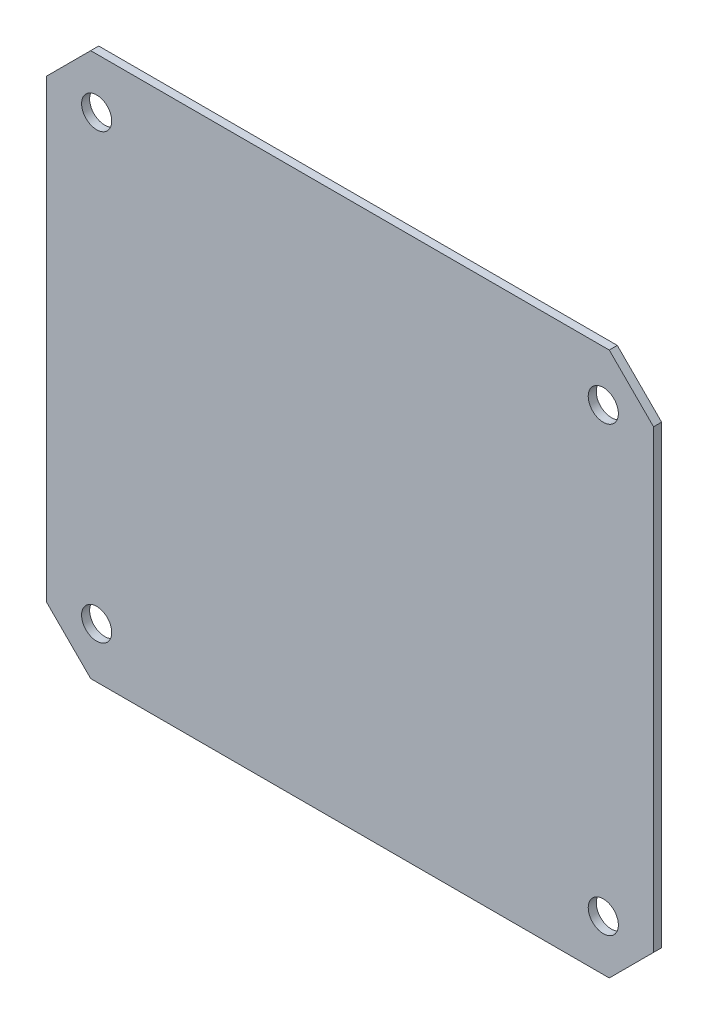
ISO-10303-21;
HEADER;
FILE_DESCRIPTION(('STEP AP214'),'2;1');
FILE_NAME('part.step','',(''),(''),'','','');
FILE_SCHEMA(('AUTOMOTIVE_DESIGN { 1 0 10303 214 1 1 1 1 }'));
ENDSEC;
DATA;
#1=APPLICATION_CONTEXT('core data for automotive mechanical design processes');
#2=APPLICATION_PROTOCOL_DEFINITION('international standard','automotive_design',2000,#1);
#3=PRODUCT_CONTEXT('',#1,'mechanical');
#4=PRODUCT('Part','Part','',(#3));
#5=PRODUCT_RELATED_PRODUCT_CATEGORY('part','',(#4));
#6=PRODUCT_DEFINITION_FORMATION('','',#4);
#7=PRODUCT_DEFINITION_CONTEXT('part definition',#1,'design');
#8=PRODUCT_DEFINITION('design','',#6,#7);
#9=PRODUCT_DEFINITION_SHAPE('','',#8);
#10=(LENGTH_UNIT() NAMED_UNIT(*) SI_UNIT(.MILLI.,.METRE.));
#11=(NAMED_UNIT(*) PLANE_ANGLE_UNIT() SI_UNIT($,.RADIAN.));
#12=(NAMED_UNIT(*) SI_UNIT($,.STERADIAN.) SOLID_ANGLE_UNIT());
#13=UNCERTAINTY_MEASURE_WITH_UNIT(LENGTH_MEASURE(1.E-05),#10,'distance_accuracy_value','');
#14=(GEOMETRIC_REPRESENTATION_CONTEXT(3) GLOBAL_UNCERTAINTY_ASSIGNED_CONTEXT((#13)) GLOBAL_UNIT_ASSIGNED_CONTEXT((#10,
#11,#12)) REPRESENTATION_CONTEXT('',''));
#15=CARTESIAN_POINT('',(0.,0.,0.));
#16=DIRECTION('',(0.,0.,1.));
#17=DIRECTION('',(1.,0.,0.));
#18=AXIS2_PLACEMENT_3D('',#15,#16,#17);
#19=CARTESIAN_POINT('',(-30.2,22.6442135623731,22.2));
#20=DIRECTION('',(0.707106781186547,-0.707106781186548,0.));
#21=DIRECTION('',(0.707106781186548,0.707106781186547,0.));
#22=AXIS2_PLACEMENT_3D('',#19,#20,#21);
#23=PLANE('',#22);
#24=DIRECTION('',(0.,0.,-1.));
#25=VECTOR('',#24,1.);
#26=CARTESIAN_POINT('',(-30.2,22.6442135623731,22.2));
#27=LINE('',#26,#25);
#28=CARTESIAN_POINT('',(-30.2,22.6442135623731,-4.5));
#29=VERTEX_POINT('',#28);
#30=CARTESIAN_POINT('',(-30.2,22.6442135623731,-5.3));
#31=VERTEX_POINT('',#30);
#32=EDGE_CURVE('E11',#29,#31,#27,.T.);
#33=ORIENTED_EDGE('',*,*,#32,.F.);
#34=DIRECTION('',(0.707106781186548,0.707106781186547,0.));
#35=VECTOR('',#34,1.);
#36=CARTESIAN_POINT('',(-30.2,22.6442135623731,-4.5));
#37=LINE('',#36,#35);
#38=CARTESIAN_POINT('',(-25.7942135623731,27.05,-4.5));
#39=VERTEX_POINT('',#38);
#40=EDGE_CURVE('E98',#29,#39,#37,.T.);
#41=ORIENTED_EDGE('',*,*,#40,.T.);
#42=DIRECTION('',(0.,0.,-1.));
#43=VECTOR('',#42,1.);
#44=CARTESIAN_POINT('',(-25.7942135623731,27.05,22.2));
#45=LINE('',#44,#43);
#46=CARTESIAN_POINT('',(-25.7942135623731,27.05,-5.3));
#47=VERTEX_POINT('',#46);
#48=EDGE_CURVE('E108',#39,#47,#45,.T.);
#49=ORIENTED_EDGE('',*,*,#48,.T.);
#50=DIRECTION('',(0.707106781186548,0.707106781186547,0.));
#51=VECTOR('',#50,1.);
#52=CARTESIAN_POINT('',(-25.7942135623731,27.05,-5.3));
#53=LINE('',#52,#51);
#54=EDGE_CURVE('E322',#31,#47,#53,.T.);
#55=ORIENTED_EDGE('',*,*,#54,.F.);
#56=EDGE_LOOP('',(#33,#41,#49,#55));
#57=FACE_BOUND('',#56,.T.);
#58=ADVANCED_FACE('F33',(#57),#23,.F.);
#59=CARTESIAN_POINT('',(-30.2,22.6442135623731,22.2));
#60=DIRECTION('',(1.,0.,0.));
#61=DIRECTION('',(0.,1.,0.));
#62=AXIS2_PLACEMENT_3D('',#59,#60,#61);
#63=PLANE('',#62);
#64=DIRECTION('',(0.,0.,-1.));
#65=VECTOR('',#64,1.);
#66=CARTESIAN_POINT('',(-30.2,-22.6442135623731,22.2));
#67=LINE('',#66,#65);
#68=CARTESIAN_POINT('',(-30.2,-22.6442135623731,-4.5));
#69=VERTEX_POINT('',#68);
#70=CARTESIAN_POINT('',(-30.2,-22.6442135623731,-5.3));
#71=VERTEX_POINT('',#70);
#72=EDGE_CURVE('E41',#69,#71,#67,.T.);
#73=ORIENTED_EDGE('',*,*,#72,.F.);
#74=DIRECTION('',(0.,1.,0.));
#75=VECTOR('',#74,1.);
#76=CARTESIAN_POINT('',(-30.2,-27.05,-4.5));
#77=LINE('',#76,#75);
#78=EDGE_CURVE('E336',#69,#29,#77,.T.);
#79=ORIENTED_EDGE('',*,*,#78,.T.);
#80=ORIENTED_EDGE('',*,*,#32,.T.);
#81=DIRECTION('',(0.,1.,0.));
#82=VECTOR('',#81,1.);
#83=CARTESIAN_POINT('',(-30.2,22.6442135623731,-5.3));
#84=LINE('',#83,#82);
#85=EDGE_CURVE('E320',#71,#31,#84,.T.);
#86=ORIENTED_EDGE('',*,*,#85,.F.);
#87=EDGE_LOOP('',(#73,#79,#80,#86));
#88=FACE_BOUND('',#87,.T.);
#89=ADVANCED_FACE('F151',(#88),#63,.F.);
#90=CARTESIAN_POINT('',(-30.2,-22.6442135623731,22.2));
#91=DIRECTION('',(0.707106781186548,0.707106781186548,0.));
#92=DIRECTION('',(-0.707106781186548,0.707106781186548,0.));
#93=AXIS2_PLACEMENT_3D('',#90,#91,#92);
#94=PLANE('',#93);
#95=DIRECTION('',(0.,0.,-1.));
#96=VECTOR('',#95,1.);
#97=CARTESIAN_POINT('',(-25.7942135623731,-27.05,22.2));
#98=LINE('',#97,#96);
#99=CARTESIAN_POINT('',(-25.7942135623731,-27.05,-4.5));
#100=VERTEX_POINT('',#99);
#101=CARTESIAN_POINT('',(-25.7942135623731,-27.05,-5.3));
#102=VERTEX_POINT('',#101);
#103=EDGE_CURVE('E131',#100,#102,#98,.T.);
#104=ORIENTED_EDGE('',*,*,#103,.F.);
#105=DIRECTION('',(-0.707106781186548,0.707106781186548,0.));
#106=VECTOR('',#105,1.);
#107=CARTESIAN_POINT('',(-30.2,-22.6442135623731,-4.5));
#108=LINE('',#107,#106);
#109=EDGE_CURVE('E111',#100,#69,#108,.T.);
#110=ORIENTED_EDGE('',*,*,#109,.T.);
#111=ORIENTED_EDGE('',*,*,#72,.T.);
#112=DIRECTION('',(-0.707106781186547,0.707106781186547,0.));
#113=VECTOR('',#112,1.);
#114=CARTESIAN_POINT('',(-30.2,-22.6442135623731,-5.3));
#115=LINE('',#114,#113);
#116=EDGE_CURVE('E118',#102,#71,#115,.T.);
#117=ORIENTED_EDGE('',*,*,#116,.F.);
#118=EDGE_LOOP('',(#104,#110,#111,#117));
#119=FACE_BOUND('',#118,.T.);
#120=ADVANCED_FACE('F149',(#119),#94,.F.);
#121=CARTESIAN_POINT('',(-25.7942135623731,-27.05,22.2));
#122=DIRECTION('',(0.,1.,0.));
#123=DIRECTION('',(0.,0.,1.));
#124=AXIS2_PLACEMENT_3D('',#121,#122,#123);
#125=PLANE('',#124);
#126=DIRECTION('',(0.,0.,-1.));
#127=VECTOR('',#126,1.);
#128=CARTESIAN_POINT('',(25.7942135623731,-27.05,22.2));
#129=LINE('',#128,#127);
#130=CARTESIAN_POINT('',(25.7942135623731,-27.05,-4.5));
#131=VERTEX_POINT('',#130);
#132=CARTESIAN_POINT('',(25.7942135623731,-27.05,-5.3));
#133=VERTEX_POINT('',#132);
#134=EDGE_CURVE('E129',#131,#133,#129,.T.);
#135=ORIENTED_EDGE('',*,*,#134,.F.);
#136=DIRECTION('',(-1.,0.,0.));
#137=VECTOR('',#136,1.);
#138=CARTESIAN_POINT('',(-30.2,-27.05,-4.5));
#139=LINE('',#138,#137);
#140=EDGE_CURVE('E103',#131,#100,#139,.T.);
#141=ORIENTED_EDGE('',*,*,#140,.T.);
#142=ORIENTED_EDGE('',*,*,#103,.T.);
#143=DIRECTION('',(-1.,0.,0.));
#144=VECTOR('',#143,1.);
#145=CARTESIAN_POINT('',(-25.7942135623731,-27.05,-5.3));
#146=LINE('',#145,#144);
#147=EDGE_CURVE('E122',#133,#102,#146,.T.);
#148=ORIENTED_EDGE('',*,*,#147,.F.);
#149=EDGE_LOOP('',(#135,#141,#142,#148));
#150=FACE_BOUND('',#149,.T.);
#151=ADVANCED_FACE('F139',(#150),#125,.F.);
#152=CARTESIAN_POINT('',(30.2,-22.6442135623731,22.2));
#153=DIRECTION('',(-0.707106781186547,0.707106781186548,0.));
#154=DIRECTION('',(-0.707106781186548,-0.707106781186547,0.));
#155=AXIS2_PLACEMENT_3D('',#152,#153,#154);
#156=PLANE('',#155);
#157=DIRECTION('',(0.,0.,-1.));
#158=VECTOR('',#157,1.);
#159=CARTESIAN_POINT('',(30.2,-22.6442135623731,22.2));
#160=LINE('',#159,#158);
#161=CARTESIAN_POINT('',(30.2,-22.6442135623731,-4.5));
#162=VERTEX_POINT('',#161);
#163=CARTESIAN_POINT('',(30.2,-22.6442135623731,-5.3));
#164=VERTEX_POINT('',#163);
#165=EDGE_CURVE('E127',#162,#164,#160,.T.);
#166=ORIENTED_EDGE('',*,*,#165,.F.);
#167=DIRECTION('',(-0.707106781186548,-0.707106781186547,0.));
#168=VECTOR('',#167,1.);
#169=CARTESIAN_POINT('',(30.2,-22.6442135623731,-4.5));
#170=LINE('',#169,#168);
#171=EDGE_CURVE('E301',#162,#131,#170,.T.);
#172=ORIENTED_EDGE('',*,*,#171,.T.);
#173=ORIENTED_EDGE('',*,*,#134,.T.);
#174=DIRECTION('',(-0.707106781186548,-0.707106781186547,0.));
#175=VECTOR('',#174,1.);
#176=CARTESIAN_POINT('',(25.7942135623731,-27.05,-5.3));
#177=LINE('',#176,#175);
#178=EDGE_CURVE('E148',#164,#133,#177,.T.);
#179=ORIENTED_EDGE('',*,*,#178,.F.);
#180=EDGE_LOOP('',(#166,#172,#173,#179));
#181=FACE_BOUND('',#180,.T.);
#182=ADVANCED_FACE('F157',(#181),#156,.F.);
#183=CARTESIAN_POINT('',(30.2,22.6442135623731,22.2));
#184=DIRECTION('',(-1.,0.,0.));
#185=DIRECTION('',(0.,-1.,0.));
#186=AXIS2_PLACEMENT_3D('',#183,#184,#185);
#187=PLANE('',#186);
#188=DIRECTION('',(0.,0.,-1.));
#189=VECTOR('',#188,1.);
#190=CARTESIAN_POINT('',(30.2,22.6442135623731,22.2));
#191=LINE('',#190,#189);
#192=CARTESIAN_POINT('',(30.2,22.6442135623731,-4.5));
#193=VERTEX_POINT('',#192);
#194=CARTESIAN_POINT('',(30.2,22.6442135623731,-5.3));
#195=VERTEX_POINT('',#194);
#196=EDGE_CURVE('E120',#193,#195,#191,.T.);
#197=ORIENTED_EDGE('',*,*,#196,.F.);
#198=DIRECTION('',(0.,1.,0.));
#199=VECTOR('',#198,1.);
#200=CARTESIAN_POINT('',(30.2,-27.05,-4.5));
#201=LINE('',#200,#199);
#202=EDGE_CURVE('E335',#162,#193,#201,.T.);
#203=ORIENTED_EDGE('',*,*,#202,.F.);
#204=ORIENTED_EDGE('',*,*,#165,.T.);
#205=DIRECTION('',(0.,-1.,0.));
#206=VECTOR('',#205,1.);
#207=CARTESIAN_POINT('',(30.2,-22.6442135623731,-5.3));
#208=LINE('',#207,#206);
#209=EDGE_CURVE('E328',#195,#164,#208,.T.);
#210=ORIENTED_EDGE('',*,*,#209,.F.);
#211=EDGE_LOOP('',(#197,#203,#204,#210));
#212=FACE_BOUND('',#211,.T.);
#213=ADVANCED_FACE('F190',(#212),#187,.F.);
#214=CARTESIAN_POINT('',(30.2,22.6442135623731,22.2));
#215=DIRECTION('',(-0.707106781186547,-0.707106781186548,0.));
#216=DIRECTION('',(0.707106781186548,-0.707106781186547,0.));
#217=AXIS2_PLACEMENT_3D('',#214,#215,#216);
#218=PLANE('',#217);
#219=DIRECTION('',(0.,0.,-1.));
#220=VECTOR('',#219,1.);
#221=CARTESIAN_POINT('',(25.7942135623731,27.05,22.2));
#222=LINE('',#221,#220);
#223=CARTESIAN_POINT('',(25.7942135623731,27.05,-4.5));
#224=VERTEX_POINT('',#223);
#225=CARTESIAN_POINT('',(25.7942135623731,27.05,-5.3));
#226=VERTEX_POINT('',#225);
#227=EDGE_CURVE('E117',#224,#226,#222,.T.);
#228=ORIENTED_EDGE('',*,*,#227,.F.);
#229=DIRECTION('',(0.707106781186548,-0.707106781186547,0.));
#230=VECTOR('',#229,1.);
#231=CARTESIAN_POINT('',(30.2,22.6442135623731,-4.5));
#232=LINE('',#231,#230);
#233=EDGE_CURVE('E48',#224,#193,#232,.T.);
#234=ORIENTED_EDGE('',*,*,#233,.T.);
#235=ORIENTED_EDGE('',*,*,#196,.T.);
#236=DIRECTION('',(0.707106781186548,-0.707106781186547,0.));
#237=VECTOR('',#236,1.);
#238=CARTESIAN_POINT('',(30.2,22.6442135623731,-5.3));
#239=LINE('',#238,#237);
#240=EDGE_CURVE('E325',#226,#195,#239,.T.);
#241=ORIENTED_EDGE('',*,*,#240,.F.);
#242=EDGE_LOOP('',(#228,#234,#235,#241));
#243=FACE_BOUND('',#242,.T.);
#244=ADVANCED_FACE('F201',(#243),#218,.F.);
#245=CARTESIAN_POINT('',(-25.7942135623731,27.05,22.2));
#246=DIRECTION('',(0.,-1.,0.));
#247=DIRECTION('',(0.,0.,-1.));
#248=AXIS2_PLACEMENT_3D('',#245,#246,#247);
#249=PLANE('',#248);
#250=ORIENTED_EDGE('',*,*,#48,.F.);
#251=DIRECTION('',(-1.,0.,0.));
#252=VECTOR('',#251,1.);
#253=CARTESIAN_POINT('',(-30.2,27.05,-4.5));
#254=LINE('',#253,#252);
#255=EDGE_CURVE('E95',#224,#39,#254,.T.);
#256=ORIENTED_EDGE('',*,*,#255,.F.);
#257=ORIENTED_EDGE('',*,*,#227,.T.);
#258=DIRECTION('',(1.,0.,0.));
#259=VECTOR('',#258,1.);
#260=CARTESIAN_POINT('',(25.7942135623731,27.05,-5.3));
#261=LINE('',#260,#259);
#262=EDGE_CURVE('E116',#47,#226,#261,.T.);
#263=ORIENTED_EDGE('',*,*,#262,.F.);
#264=EDGE_LOOP('',(#250,#256,#257,#263));
#265=FACE_BOUND('',#264,.T.);
#266=ADVANCED_FACE('F114',(#265),#249,.F.);
#267=CARTESIAN_POINT('',(25.2,22.03,-4.5));
#268=DIRECTION('',(0.,0.,1.));
#269=DIRECTION('',(1.,0.,0.));
#270=AXIS2_PLACEMENT_3D('',#267,#268,#269);
#271=CYLINDRICAL_SURFACE('',#270,1.5);
#272=CARTESIAN_POINT('',(25.2,22.03,-4.5));
#273=DIRECTION('',(0.,0.,-1.));
#274=DIRECTION('',(-1.,0.,0.));
#275=AXIS2_PLACEMENT_3D('',#272,#273,#274);
#276=CIRCLE('',#275,1.5);
#277=CARTESIAN_POINT('',(23.7,22.03,-4.5));
#278=VERTEX_POINT('',#277);
#279=EDGE_CURVE('E299',#278,#278,#276,.F.);
#280=ORIENTED_EDGE('',*,*,#279,.T.);
#281=EDGE_LOOP('',(#280));
#282=FACE_BOUND('',#281,.T.);
#283=CARTESIAN_POINT('',(25.2,22.03,-5.3));
#284=DIRECTION('',(0.,0.,-1.));
#285=DIRECTION('',(-1.,0.,0.));
#286=AXIS2_PLACEMENT_3D('',#283,#284,#285);
#287=CIRCLE('',#286,1.5);
#288=CARTESIAN_POINT('',(23.7,22.03,-5.3));
#289=VERTEX_POINT('',#288);
#290=EDGE_CURVE('E311',#289,#289,#287,.T.);
#291=ORIENTED_EDGE('',*,*,#290,.T.);
#292=EDGE_LOOP('',(#291));
#293=FACE_BOUND('',#292,.T.);
#294=ADVANCED_FACE('F222',(#282,#293),#271,.F.);
#295=CARTESIAN_POINT('',(-25.2,22.03,-4.5));
#296=DIRECTION('',(0.,0.,1.));
#297=DIRECTION('',(1.,0.,0.));
#298=AXIS2_PLACEMENT_3D('',#295,#296,#297);
#299=CYLINDRICAL_SURFACE('',#298,1.5);
#300=CARTESIAN_POINT('',(-25.2,22.03,-4.5));
#301=DIRECTION('',(0.,0.,-1.));
#302=DIRECTION('',(-1.,0.,0.));
#303=AXIS2_PLACEMENT_3D('',#300,#301,#302);
#304=CIRCLE('',#303,1.5);
#305=CARTESIAN_POINT('',(-26.7,22.03,-4.5));
#306=VERTEX_POINT('',#305);
#307=EDGE_CURVE('E289',#306,#306,#304,.F.);
#308=ORIENTED_EDGE('',*,*,#307,.T.);
#309=EDGE_LOOP('',(#308));
#310=FACE_BOUND('',#309,.T.);
#311=CARTESIAN_POINT('',(-25.2,22.03,-5.3));
#312=DIRECTION('',(0.,0.,-1.));
#313=DIRECTION('',(-1.,0.,0.));
#314=AXIS2_PLACEMENT_3D('',#311,#312,#313);
#315=CIRCLE('',#314,1.5);
#316=CARTESIAN_POINT('',(-26.7,22.03,-5.3));
#317=VERTEX_POINT('',#316);
#318=EDGE_CURVE('E110',#317,#317,#315,.T.);
#319=ORIENTED_EDGE('',*,*,#318,.T.);
#320=EDGE_LOOP('',(#319));
#321=FACE_BOUND('',#320,.T.);
#322=ADVANCED_FACE('F232',(#310,#321),#299,.F.);
#323=CARTESIAN_POINT('',(-25.2,-22.03,-4.5));
#324=DIRECTION('',(0.,0.,1.));
#325=DIRECTION('',(1.,0.,0.));
#326=AXIS2_PLACEMENT_3D('',#323,#324,#325);
#327=CYLINDRICAL_SURFACE('',#326,1.5);
#328=CARTESIAN_POINT('',(-25.2,-22.03,-4.5));
#329=DIRECTION('',(0.,0.,-1.));
#330=DIRECTION('',(-1.,0.,0.));
#331=AXIS2_PLACEMENT_3D('',#328,#329,#330);
#332=CIRCLE('',#331,1.5);
#333=CARTESIAN_POINT('',(-26.7,-22.03,-4.5));
#334=VERTEX_POINT('',#333);
#335=EDGE_CURVE('E296',#334,#334,#332,.F.);
#336=ORIENTED_EDGE('',*,*,#335,.T.);
#337=EDGE_LOOP('',(#336));
#338=FACE_BOUND('',#337,.T.);
#339=CARTESIAN_POINT('',(-25.2,-22.03,-5.3));
#340=DIRECTION('',(0.,0.,-1.));
#341=DIRECTION('',(-1.,0.,0.));
#342=AXIS2_PLACEMENT_3D('',#339,#340,#341);
#343=CIRCLE('',#342,1.5);
#344=CARTESIAN_POINT('',(-26.7,-22.03,-5.3));
#345=VERTEX_POINT('',#344);
#346=EDGE_CURVE('E317',#345,#345,#343,.T.);
#347=ORIENTED_EDGE('',*,*,#346,.T.);
#348=EDGE_LOOP('',(#347));
#349=FACE_BOUND('',#348,.T.);
#350=ADVANCED_FACE('F243',(#338,#349),#327,.F.);
#351=CARTESIAN_POINT('',(25.2,-22.03,-4.5));
#352=DIRECTION('',(0.,0.,1.));
#353=DIRECTION('',(1.,0.,0.));
#354=AXIS2_PLACEMENT_3D('',#351,#352,#353);
#355=CYLINDRICAL_SURFACE('',#354,1.5);
#356=CARTESIAN_POINT('',(25.2,-22.03,-4.5));
#357=DIRECTION('',(0.,0.,-1.));
#358=DIRECTION('',(-1.,0.,0.));
#359=AXIS2_PLACEMENT_3D('',#356,#357,#358);
#360=CIRCLE('',#359,1.5);
#361=CARTESIAN_POINT('',(23.7,-22.03,-4.5));
#362=VERTEX_POINT('',#361);
#363=EDGE_CURVE('E36',#362,#362,#360,.F.);
#364=ORIENTED_EDGE('',*,*,#363,.T.);
#365=EDGE_LOOP('',(#364));
#366=FACE_BOUND('',#365,.T.);
#367=CARTESIAN_POINT('',(25.2,-22.03,-5.3));
#368=DIRECTION('',(0.,0.,-1.));
#369=DIRECTION('',(-1.,0.,0.));
#370=AXIS2_PLACEMENT_3D('',#367,#368,#369);
#371=CIRCLE('',#370,1.5);
#372=CARTESIAN_POINT('',(23.7,-22.03,-5.3));
#373=VERTEX_POINT('',#372);
#374=EDGE_CURVE('E314',#373,#373,#371,.T.);
#375=ORIENTED_EDGE('',*,*,#374,.T.);
#376=EDGE_LOOP('',(#375));
#377=FACE_BOUND('',#376,.T.);
#378=ADVANCED_FACE('F254',(#366,#377),#355,.F.);
#379=CARTESIAN_POINT('',(0.,0.,-5.3));
#380=DIRECTION('',(0.,0.,1.));
#381=DIRECTION('',(1.,0.,0.));
#382=AXIS2_PLACEMENT_3D('',#379,#380,#381);
#383=PLANE('',#382);
#384=ORIENTED_EDGE('',*,*,#85,.T.);
#385=ORIENTED_EDGE('',*,*,#54,.T.);
#386=ORIENTED_EDGE('',*,*,#262,.T.);
#387=ORIENTED_EDGE('',*,*,#240,.T.);
#388=ORIENTED_EDGE('',*,*,#209,.T.);
#389=ORIENTED_EDGE('',*,*,#178,.T.);
#390=ORIENTED_EDGE('',*,*,#147,.T.);
#391=ORIENTED_EDGE('',*,*,#116,.T.);
#392=EDGE_LOOP('',(#384,#385,#386,#387,#388,#389,#390,#391));
#393=FACE_BOUND('',#392,.T.);
#394=ORIENTED_EDGE('',*,*,#346,.F.);
#395=EDGE_LOOP('',(#394));
#396=FACE_BOUND('',#395,.T.);
#397=ORIENTED_EDGE('',*,*,#374,.F.);
#398=EDGE_LOOP('',(#397));
#399=FACE_BOUND('',#398,.T.);
#400=ORIENTED_EDGE('',*,*,#290,.F.);
#401=EDGE_LOOP('',(#400));
#402=FACE_BOUND('',#401,.T.);
#403=ORIENTED_EDGE('',*,*,#318,.F.);
#404=EDGE_LOOP('',(#403));
#405=FACE_BOUND('',#404,.T.);
#406=ADVANCED_FACE('F143',(#393,#396,#399,#402,#405),#383,.F.);
#407=CARTESIAN_POINT('',(-30.2,-27.05,-4.5));
#408=DIRECTION('',(0.,0.,-1.));
#409=DIRECTION('',(-1.,0.,0.));
#410=AXIS2_PLACEMENT_3D('',#407,#408,#409);
#411=PLANE('',#410);
#412=ORIENTED_EDGE('',*,*,#307,.F.);
#413=EDGE_LOOP('',(#412));
#414=FACE_BOUND('',#413,.T.);
#415=ORIENTED_EDGE('',*,*,#363,.F.);
#416=EDGE_LOOP('',(#415));
#417=FACE_BOUND('',#416,.T.);
#418=ORIENTED_EDGE('',*,*,#335,.F.);
#419=EDGE_LOOP('',(#418));
#420=FACE_BOUND('',#419,.T.);
#421=ORIENTED_EDGE('',*,*,#279,.F.);
#422=EDGE_LOOP('',(#421));
#423=FACE_BOUND('',#422,.T.);
#424=ORIENTED_EDGE('',*,*,#78,.F.);
#425=ORIENTED_EDGE('',*,*,#109,.F.);
#426=ORIENTED_EDGE('',*,*,#140,.F.);
#427=ORIENTED_EDGE('',*,*,#171,.F.);
#428=ORIENTED_EDGE('',*,*,#202,.T.);
#429=ORIENTED_EDGE('',*,*,#233,.F.);
#430=ORIENTED_EDGE('',*,*,#255,.T.);
#431=ORIENTED_EDGE('',*,*,#40,.F.);
#432=EDGE_LOOP('',(#424,#425,#426,#427,#428,#429,#430,#431));
#433=FACE_BOUND('',#432,.T.);
#434=ADVANCED_FACE('F97',(#414,#417,#420,#423,#433),#411,.F.);
#435=CLOSED_SHELL('',(#58,#89,#120,#151,#182,#213,#244,#266,#294,#322,#350,#378,#406,#434));
#436=MANIFOLD_SOLID_BREP('B2',#435);
#437=ADVANCED_BREP_SHAPE_REPRESENTATION('',(#18,#436),#14);
#438=SHAPE_DEFINITION_REPRESENTATION(#9,#437);
ENDSEC;
END-ISO-10303-21;
